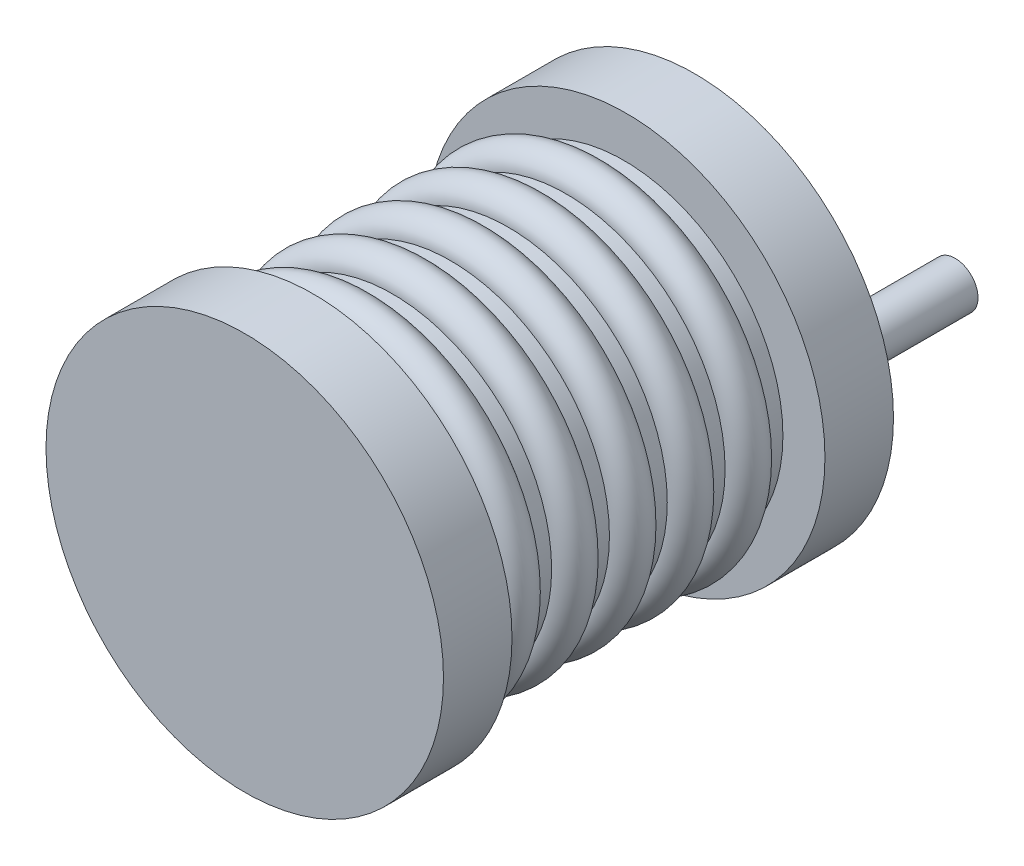
ISO-10303-21;
HEADER;
FILE_DESCRIPTION(('STEP AP214'),'2;1');
FILE_NAME('part.step','',(''),(''),'','','');
FILE_SCHEMA(('AUTOMOTIVE_DESIGN { 1 0 10303 214 1 1 1 1 }'));
ENDSEC;
DATA;
#1=APPLICATION_CONTEXT('core data for automotive mechanical design processes');
#2=APPLICATION_PROTOCOL_DEFINITION('international standard','automotive_design',2000,#1);
#3=PRODUCT_CONTEXT('',#1,'mechanical');
#4=PRODUCT('Part','Part','',(#3));
#5=PRODUCT_RELATED_PRODUCT_CATEGORY('part','',(#4));
#6=PRODUCT_DEFINITION_FORMATION('','',#4);
#7=PRODUCT_DEFINITION_CONTEXT('part definition',#1,'design');
#8=PRODUCT_DEFINITION('design','',#6,#7);
#9=PRODUCT_DEFINITION_SHAPE('','',#8);
#10=(LENGTH_UNIT() NAMED_UNIT(*) SI_UNIT(.MILLI.,.METRE.));
#11=(NAMED_UNIT(*) PLANE_ANGLE_UNIT() SI_UNIT($,.RADIAN.));
#12=(NAMED_UNIT(*) SI_UNIT($,.STERADIAN.) SOLID_ANGLE_UNIT());
#13=UNCERTAINTY_MEASURE_WITH_UNIT(LENGTH_MEASURE(1.E-05),#10,'distance_accuracy_value','');
#14=(GEOMETRIC_REPRESENTATION_CONTEXT(3) GLOBAL_UNCERTAINTY_ASSIGNED_CONTEXT((#13)) GLOBAL_UNIT_ASSIGNED_CONTEXT((#10,
#11,#12)) REPRESENTATION_CONTEXT('',''));
#15=CARTESIAN_POINT('',(0.,0.,0.));
#16=DIRECTION('',(0.,0.,1.));
#17=DIRECTION('',(1.,0.,0.));
#18=AXIS2_PLACEMENT_3D('',#15,#16,#17);
#19=CARTESIAN_POINT('',(2.5,0.,1.75));
#20=DIRECTION('',(0.,0.,1.));
#21=DIRECTION('',(1.,0.,0.));
#22=AXIS2_PLACEMENT_3D('',#19,#20,#21);
#23=CYLINDRICAL_SURFACE('',#22,3.48);
#24=CARTESIAN_POINT('',(2.5,0.,2.171875));
#25=DIRECTION('',(0.,0.,-1.));
#26=DIRECTION('',(1.,0.,0.));
#27=AXIS2_PLACEMENT_3D('',#24,#25,#26);
#28=CIRCLE('',#27,3.48);
#29=CARTESIAN_POINT('',(5.98,0.,2.171875));
#30=VERTEX_POINT('',#29);
#31=EDGE_CURVE('E10',#30,#30,#28,.T.);
#32=ORIENTED_EDGE('',*,*,#31,.T.);
#33=EDGE_LOOP('',(#32));
#34=FACE_BOUND('',#33,.T.);
#35=CARTESIAN_POINT('',(2.5,0.,1.75));
#36=DIRECTION('',(0.,0.,-1.));
#37=DIRECTION('',(1.,0.,0.));
#38=AXIS2_PLACEMENT_3D('',#35,#36,#37);
#39=CIRCLE('',#38,3.48);
#40=CARTESIAN_POINT('',(5.98,0.,1.75));
#41=VERTEX_POINT('',#40);
#42=EDGE_CURVE('E23',#41,#41,#39,.T.);
#43=ORIENTED_EDGE('',*,*,#42,.F.);
#44=EDGE_LOOP('',(#43));
#45=FACE_BOUND('',#44,.T.);
#46=ADVANCED_FACE('F15',(#34,#45),#23,.T.);
#47=CARTESIAN_POINT('',(2.5,0.,1.75));
#48=DIRECTION('',(0.,0.,-1.));
#49=DIRECTION('',(1.,0.,0.));
#50=AXIS2_PLACEMENT_3D('',#47,#48,#49);
#51=PLANE('',#50);
#52=ORIENTED_EDGE('',*,*,#42,.T.);
#53=EDGE_LOOP('',(#52));
#54=FACE_BOUND('',#53,.T.);
#55=CARTESIAN_POINT('',(2.5,0.,1.75));
#56=DIRECTION('',(0.,0.,-1.));
#57=DIRECTION('',(1.,0.,0.));
#58=AXIS2_PLACEMENT_3D('',#55,#56,#57);
#59=CIRCLE('',#58,0.87);
#60=CARTESIAN_POINT('',(3.37,0.,1.75));
#61=VERTEX_POINT('',#60);
#62=EDGE_CURVE('E31',#61,#61,#59,.T.);
#63=ORIENTED_EDGE('',*,*,#62,.F.);
#64=EDGE_LOOP('',(#63));
#65=FACE_BOUND('',#64,.T.);
#66=ADVANCED_FACE('F112',(#54,#65),#51,.T.);
#67=CARTESIAN_POINT('',(2.5,0.,2.59375));
#68=DIRECTION('',(0.,0.,1.));
#69=DIRECTION('',(1.,0.,0.));
#70=AXIS2_PLACEMENT_3D('',#67,#68,#69);
#71=TOROIDAL_SURFACE('',#70,3.48,0.421875);
#72=CARTESIAN_POINT('',(2.5,0.,3.015625));
#73=DIRECTION('',(0.,0.,-1.));
#74=DIRECTION('',(1.,0.,0.));
#75=AXIS2_PLACEMENT_3D('',#72,#73,#74);
#76=CIRCLE('',#75,3.48);
#77=CARTESIAN_POINT('',(5.98,0.,3.015625));
#78=VERTEX_POINT('',#77);
#79=EDGE_CURVE('E28',#78,#78,#76,.T.);
#80=ORIENTED_EDGE('',*,*,#79,.T.);
#81=EDGE_LOOP('',(#80));
#82=FACE_BOUND('',#81,.T.);
#83=ORIENTED_EDGE('',*,*,#31,.F.);
#84=EDGE_LOOP('',(#83));
#85=FACE_BOUND('',#84,.T.);
#86=ADVANCED_FACE('F117',(#82,#85),#71,.T.);
#87=CARTESIAN_POINT('',(2.5,0.,1.7));
#88=DIRECTION('',(0.,0.,1.));
#89=DIRECTION('',(1.,0.,0.));
#90=AXIS2_PLACEMENT_3D('',#87,#88,#89);
#91=CYLINDRICAL_SURFACE('',#90,0.87);
#92=ORIENTED_EDGE('',*,*,#62,.T.);
#93=EDGE_LOOP('',(#92));
#94=FACE_BOUND('',#93,.T.);
#95=CARTESIAN_POINT('',(2.5,0.,1.7));
#96=DIRECTION('',(0.,0.,-1.));
#97=DIRECTION('',(1.,0.,0.));
#98=AXIS2_PLACEMENT_3D('',#95,#96,#97);
#99=CIRCLE('',#98,0.87);
#100=CARTESIAN_POINT('',(3.37,0.,1.7));
#101=VERTEX_POINT('',#100);
#102=EDGE_CURVE('E37',#101,#101,#99,.T.);
#103=ORIENTED_EDGE('',*,*,#102,.F.);
#104=EDGE_LOOP('',(#103));
#105=FACE_BOUND('',#104,.T.);
#106=ADVANCED_FACE('F124',(#94,#105),#91,.T.);
#107=CARTESIAN_POINT('',(2.5,0.,3.4375));
#108=DIRECTION('',(0.,0.,-1.));
#109=DIRECTION('',(1.,0.,0.));
#110=AXIS2_PLACEMENT_3D('',#107,#108,#109);
#111=CYLINDRICAL_SURFACE('',#110,3.48);
#112=ORIENTED_EDGE('',*,*,#79,.F.);
#113=EDGE_LOOP('',(#112));
#114=FACE_BOUND('',#113,.T.);
#115=CARTESIAN_POINT('',(2.5,0.,3.4375));
#116=DIRECTION('',(0.,0.,-1.));
#117=DIRECTION('',(1.,0.,0.));
#118=AXIS2_PLACEMENT_3D('',#115,#116,#117);
#119=CIRCLE('',#118,3.48);
#120=CARTESIAN_POINT('',(5.98,0.,3.4375));
#121=VERTEX_POINT('',#120);
#122=EDGE_CURVE('E34',#121,#121,#119,.T.);
#123=ORIENTED_EDGE('',*,*,#122,.T.);
#124=EDGE_LOOP('',(#123));
#125=FACE_BOUND('',#124,.T.);
#126=ADVANCED_FACE('F128',(#114,#125),#111,.T.);
#127=CARTESIAN_POINT('',(2.5,0.,1.7));
#128=DIRECTION('',(0.,0.,-1.));
#129=DIRECTION('',(1.,0.,0.));
#130=AXIS2_PLACEMENT_3D('',#127,#128,#129);
#131=PLANE('',#130);
#132=CARTESIAN_POINT('',(2.5,0.,1.7));
#133=DIRECTION('',(0.,0.,-1.));
#134=DIRECTION('',(1.,0.,0.));
#135=AXIS2_PLACEMENT_3D('',#132,#133,#134);
#136=CIRCLE('',#135,4.35);
#137=CARTESIAN_POINT('',(6.85,0.,1.7));
#138=VERTEX_POINT('',#137);
#139=EDGE_CURVE('E43',#138,#138,#136,.T.);
#140=ORIENTED_EDGE('',*,*,#139,.F.);
#141=EDGE_LOOP('',(#140));
#142=FACE_BOUND('',#141,.T.);
#143=ORIENTED_EDGE('',*,*,#102,.T.);
#144=EDGE_LOOP('',(#143));
#145=FACE_BOUND('',#144,.T.);
#146=ADVANCED_FACE('F132',(#142,#145),#131,.F.);
#147=CARTESIAN_POINT('',(2.5,0.,3.859375));
#148=DIRECTION('',(0.,0.,1.));
#149=DIRECTION('',(1.,0.,0.));
#150=AXIS2_PLACEMENT_3D('',#147,#148,#149);
#151=TOROIDAL_SURFACE('',#150,3.48,0.421875);
#152=CARTESIAN_POINT('',(2.5,0.,4.28125));
#153=DIRECTION('',(0.,0.,-1.));
#154=DIRECTION('',(1.,0.,0.));
#155=AXIS2_PLACEMENT_3D('',#152,#153,#154);
#156=CIRCLE('',#155,3.48);
#157=CARTESIAN_POINT('',(5.98,0.,4.28125));
#158=VERTEX_POINT('',#157);
#159=EDGE_CURVE('E40',#158,#158,#156,.T.);
#160=ORIENTED_EDGE('',*,*,#159,.T.);
#161=EDGE_LOOP('',(#160));
#162=FACE_BOUND('',#161,.T.);
#163=ORIENTED_EDGE('',*,*,#122,.F.);
#164=EDGE_LOOP('',(#163));
#165=FACE_BOUND('',#164,.T.);
#166=ADVANCED_FACE('F136',(#162,#165),#151,.T.);
#167=CARTESIAN_POINT('',(2.5,0.,0.2));
#168=DIRECTION('',(0.,0.,1.));
#169=DIRECTION('',(1.,0.,0.));
#170=AXIS2_PLACEMENT_3D('',#167,#168,#169);
#171=CYLINDRICAL_SURFACE('',#170,4.35);
#172=ORIENTED_EDGE('',*,*,#139,.T.);
#173=EDGE_LOOP('',(#172));
#174=FACE_BOUND('',#173,.T.);
#175=CARTESIAN_POINT('',(2.5,0.,0.2));
#176=DIRECTION('',(0.,0.,-1.));
#177=DIRECTION('',(1.,0.,0.));
#178=AXIS2_PLACEMENT_3D('',#175,#176,#177);
#179=CIRCLE('',#178,4.35);
#180=CARTESIAN_POINT('',(6.85,0.,0.2));
#181=VERTEX_POINT('',#180);
#182=EDGE_CURVE('E49',#181,#181,#179,.T.);
#183=ORIENTED_EDGE('',*,*,#182,.F.);
#184=EDGE_LOOP('',(#183));
#185=FACE_BOUND('',#184,.T.);
#186=ADVANCED_FACE('F140',(#174,#185),#171,.T.);
#187=CARTESIAN_POINT('',(2.5,0.,4.703125));
#188=DIRECTION('',(0.,0.,-1.));
#189=DIRECTION('',(1.,0.,0.));
#190=AXIS2_PLACEMENT_3D('',#187,#188,#189);
#191=CYLINDRICAL_SURFACE('',#190,3.48);
#192=ORIENTED_EDGE('',*,*,#159,.F.);
#193=EDGE_LOOP('',(#192));
#194=FACE_BOUND('',#193,.T.);
#195=CARTESIAN_POINT('',(2.5,0.,4.703125));
#196=DIRECTION('',(0.,0.,-1.));
#197=DIRECTION('',(1.,0.,0.));
#198=AXIS2_PLACEMENT_3D('',#195,#196,#197);
#199=CIRCLE('',#198,3.48);
#200=CARTESIAN_POINT('',(5.98,0.,4.703125));
#201=VERTEX_POINT('',#200);
#202=EDGE_CURVE('E46',#201,#201,#199,.T.);
#203=ORIENTED_EDGE('',*,*,#202,.T.);
#204=EDGE_LOOP('',(#203));
#205=FACE_BOUND('',#204,.T.);
#206=ADVANCED_FACE('F144',(#194,#205),#191,.T.);
#207=CARTESIAN_POINT('',(2.5,0.,0.2));
#208=DIRECTION('',(0.,0.,-1.));
#209=DIRECTION('',(1.,0.,0.));
#210=AXIS2_PLACEMENT_3D('',#207,#208,#209);
#211=PLANE('',#210);
#212=ORIENTED_EDGE('',*,*,#182,.T.);
#213=EDGE_LOOP('',(#212));
#214=FACE_BOUND('',#213,.T.);
#215=CARTESIAN_POINT('',(0.,0.,0.2));
#216=DIRECTION('',(0.,0.,1.));
#217=DIRECTION('',(1.,0.,0.));
#218=AXIS2_PLACEMENT_3D('',#215,#216,#217);
#219=CIRCLE('',#218,0.5);
#220=CARTESIAN_POINT('',(0.5,0.,0.2));
#221=VERTEX_POINT('',#220);
#222=EDGE_CURVE('E52',#221,#221,#219,.T.);
#223=ORIENTED_EDGE('',*,*,#222,.T.);
#224=EDGE_LOOP('',(#223));
#225=FACE_BOUND('',#224,.T.);
#226=CARTESIAN_POINT('',(2.5,0.,0.2));
#227=DIRECTION('',(0.,0.,-1.));
#228=DIRECTION('',(1.,0.,0.));
#229=AXIS2_PLACEMENT_3D('',#226,#227,#228);
#230=CIRCLE('',#229,1.5);
#231=CARTESIAN_POINT('',(4.,0.,0.2));
#232=VERTEX_POINT('',#231);
#233=EDGE_CURVE('E58',#232,#232,#230,.T.);
#234=ORIENTED_EDGE('',*,*,#233,.F.);
#235=EDGE_LOOP('',(#234));
#236=FACE_BOUND('',#235,.T.);
#237=CARTESIAN_POINT('',(5.,0.,0.2));
#238=DIRECTION('',(0.,0.,1.));
#239=DIRECTION('',(1.,0.,0.));
#240=AXIS2_PLACEMENT_3D('',#237,#238,#239);
#241=CIRCLE('',#240,0.5);
#242=CARTESIAN_POINT('',(5.5,0.,0.2));
#243=VERTEX_POINT('',#242);
#244=EDGE_CURVE('E57',#243,#243,#241,.T.);
#245=ORIENTED_EDGE('',*,*,#244,.T.);
#246=EDGE_LOOP('',(#245));
#247=FACE_BOUND('',#246,.T.);
#248=ADVANCED_FACE('F148',(#214,#225,#236,#247),#211,.T.);
#249=CARTESIAN_POINT('',(2.5,0.,5.125));
#250=DIRECTION('',(0.,0.,1.));
#251=DIRECTION('',(1.,0.,0.));
#252=AXIS2_PLACEMENT_3D('',#249,#250,#251);
#253=TOROIDAL_SURFACE('',#252,3.48,0.421875);
#254=CARTESIAN_POINT('',(2.5,0.,5.546875));
#255=DIRECTION('',(0.,0.,-1.));
#256=DIRECTION('',(1.,0.,0.));
#257=AXIS2_PLACEMENT_3D('',#254,#255,#256);
#258=CIRCLE('',#257,3.48);
#259=CARTESIAN_POINT('',(5.98,0.,5.546875));
#260=VERTEX_POINT('',#259);
#261=EDGE_CURVE('E65',#260,#260,#258,.T.);
#262=ORIENTED_EDGE('',*,*,#261,.T.);
#263=EDGE_LOOP('',(#262));
#264=FACE_BOUND('',#263,.T.);
#265=ORIENTED_EDGE('',*,*,#202,.F.);
#266=EDGE_LOOP('',(#265));
#267=FACE_BOUND('',#266,.T.);
#268=ADVANCED_FACE('F152',(#264,#267),#253,.T.);
#269=CARTESIAN_POINT('',(0.,0.,0.5));
#270=DIRECTION('',(0.,0.,1.));
#271=DIRECTION('',(1.,0.,0.));
#272=AXIS2_PLACEMENT_3D('',#269,#270,#271);
#273=CYLINDRICAL_SURFACE('',#272,0.5);
#274=CARTESIAN_POINT('',(0.,0.,-3.));
#275=DIRECTION('',(0.,0.,1.));
#276=DIRECTION('',(1.,0.,0.));
#277=AXIS2_PLACEMENT_3D('',#274,#275,#276);
#278=CIRCLE('',#277,0.5);
#279=CARTESIAN_POINT('',(0.5,0.,-3.));
#280=VERTEX_POINT('',#279);
#281=EDGE_CURVE('E61',#280,#280,#278,.T.);
#282=ORIENTED_EDGE('',*,*,#281,.T.);
#283=EDGE_LOOP('',(#282));
#284=FACE_BOUND('',#283,.T.);
#285=ORIENTED_EDGE('',*,*,#222,.F.);
#286=EDGE_LOOP('',(#285));
#287=FACE_BOUND('',#286,.T.);
#288=ADVANCED_FACE('F156',(#284,#287),#273,.T.);
#289=CARTESIAN_POINT('',(2.5,0.,0.05));
#290=DIRECTION('',(0.,0.,1.));
#291=DIRECTION('',(1.,0.,0.));
#292=AXIS2_PLACEMENT_3D('',#289,#290,#291);
#293=CYLINDRICAL_SURFACE('',#292,1.5);
#294=ORIENTED_EDGE('',*,*,#233,.T.);
#295=EDGE_LOOP('',(#294));
#296=FACE_BOUND('',#295,.T.);
#297=CARTESIAN_POINT('',(2.5,0.,0.05));
#298=DIRECTION('',(0.,0.,-1.));
#299=DIRECTION('',(1.,0.,0.));
#300=AXIS2_PLACEMENT_3D('',#297,#298,#299);
#301=CIRCLE('',#300,1.5);
#302=CARTESIAN_POINT('',(4.,0.,0.05));
#303=VERTEX_POINT('',#302);
#304=EDGE_CURVE('E70',#303,#303,#301,.T.);
#305=ORIENTED_EDGE('',*,*,#304,.F.);
#306=EDGE_LOOP('',(#305));
#307=FACE_BOUND('',#306,.T.);
#308=ADVANCED_FACE('F160',(#296,#307),#293,.T.);
#309=CARTESIAN_POINT('',(5.,0.,0.5));
#310=DIRECTION('',(0.,0.,1.));
#311=DIRECTION('',(1.,0.,0.));
#312=AXIS2_PLACEMENT_3D('',#309,#310,#311);
#313=CYLINDRICAL_SURFACE('',#312,0.5);
#314=CARTESIAN_POINT('',(5.,0.,-3.));
#315=DIRECTION('',(0.,0.,1.));
#316=DIRECTION('',(1.,0.,0.));
#317=AXIS2_PLACEMENT_3D('',#314,#315,#316);
#318=CIRCLE('',#317,0.5);
#319=CARTESIAN_POINT('',(5.5,0.,-3.));
#320=VERTEX_POINT('',#319);
#321=EDGE_CURVE('E62',#320,#320,#318,.T.);
#322=ORIENTED_EDGE('',*,*,#321,.T.);
#323=EDGE_LOOP('',(#322));
#324=FACE_BOUND('',#323,.T.);
#325=ORIENTED_EDGE('',*,*,#244,.F.);
#326=EDGE_LOOP('',(#325));
#327=FACE_BOUND('',#326,.T.);
#328=ADVANCED_FACE('F164',(#324,#327),#313,.T.);
#329=CARTESIAN_POINT('',(2.5,0.,5.96875));
#330=DIRECTION('',(0.,0.,-1.));
#331=DIRECTION('',(1.,0.,0.));
#332=AXIS2_PLACEMENT_3D('',#329,#330,#331);
#333=CYLINDRICAL_SURFACE('',#332,3.48);
#334=ORIENTED_EDGE('',*,*,#261,.F.);
#335=EDGE_LOOP('',(#334));
#336=FACE_BOUND('',#335,.T.);
#337=CARTESIAN_POINT('',(2.5,0.,5.96875));
#338=DIRECTION('',(0.,0.,-1.));
#339=DIRECTION('',(1.,0.,0.));
#340=AXIS2_PLACEMENT_3D('',#337,#338,#339);
#341=CIRCLE('',#340,3.48);
#342=CARTESIAN_POINT('',(5.98,0.,5.96875));
#343=VERTEX_POINT('',#342);
#344=EDGE_CURVE('E73',#343,#343,#341,.T.);
#345=ORIENTED_EDGE('',*,*,#344,.T.);
#346=EDGE_LOOP('',(#345));
#347=FACE_BOUND('',#346,.T.);
#348=ADVANCED_FACE('F168',(#336,#347),#333,.T.);
#349=CARTESIAN_POINT('',(0.5,0.,-3.));
#350=DIRECTION('',(0.,0.,-1.));
#351=DIRECTION('',(-1.,0.,0.));
#352=AXIS2_PLACEMENT_3D('',#349,#350,#351);
#353=PLANE('',#352);
#354=ORIENTED_EDGE('',*,*,#281,.F.);
#355=EDGE_LOOP('',(#354));
#356=FACE_BOUND('',#355,.T.);
#357=ADVANCED_FACE('F172',(#356),#353,.T.);
#358=CARTESIAN_POINT('',(2.5,0.,0.05));
#359=DIRECTION('',(0.,0.,-1.));
#360=DIRECTION('',(1.,0.,0.));
#361=AXIS2_PLACEMENT_3D('',#358,#359,#360);
#362=PLANE('',#361);
#363=ORIENTED_EDGE('',*,*,#304,.T.);
#364=EDGE_LOOP('',(#363));
#365=FACE_BOUND('',#364,.T.);
#366=ADVANCED_FACE('F176',(#365),#362,.T.);
#367=CARTESIAN_POINT('',(5.5,0.,-3.));
#368=DIRECTION('',(0.,0.,-1.));
#369=DIRECTION('',(-1.,0.,0.));
#370=AXIS2_PLACEMENT_3D('',#367,#368,#369);
#371=PLANE('',#370);
#372=ORIENTED_EDGE('',*,*,#321,.F.);
#373=EDGE_LOOP('',(#372));
#374=FACE_BOUND('',#373,.T.);
#375=ADVANCED_FACE('F180',(#374),#371,.T.);
#376=CARTESIAN_POINT('',(2.5,0.,6.390625));
#377=DIRECTION('',(0.,0.,1.));
#378=DIRECTION('',(1.,0.,0.));
#379=AXIS2_PLACEMENT_3D('',#376,#377,#378);
#380=TOROIDAL_SURFACE('',#379,3.48,0.421875);
#381=CARTESIAN_POINT('',(2.5,0.,6.8125));
#382=DIRECTION('',(0.,0.,-1.));
#383=DIRECTION('',(1.,0.,0.));
#384=AXIS2_PLACEMENT_3D('',#381,#382,#383);
#385=CIRCLE('',#384,3.48);
#386=CARTESIAN_POINT('',(5.98,0.,6.8125));
#387=VERTEX_POINT('',#386);
#388=EDGE_CURVE('E74',#387,#387,#385,.T.);
#389=ORIENTED_EDGE('',*,*,#388,.T.);
#390=EDGE_LOOP('',(#389));
#391=FACE_BOUND('',#390,.T.);
#392=ORIENTED_EDGE('',*,*,#344,.F.);
#393=EDGE_LOOP('',(#392));
#394=FACE_BOUND('',#393,.T.);
#395=ADVANCED_FACE('F184',(#391,#394),#380,.T.);
#396=CARTESIAN_POINT('',(2.5,0.,7.234375));
#397=DIRECTION('',(0.,0.,-1.));
#398=DIRECTION('',(1.,0.,0.));
#399=AXIS2_PLACEMENT_3D('',#396,#397,#398);
#400=CYLINDRICAL_SURFACE('',#399,3.48);
#401=ORIENTED_EDGE('',*,*,#388,.F.);
#402=EDGE_LOOP('',(#401));
#403=FACE_BOUND('',#402,.T.);
#404=CARTESIAN_POINT('',(2.5,0.,7.234375));
#405=DIRECTION('',(0.,0.,-1.));
#406=DIRECTION('',(1.,0.,0.));
#407=AXIS2_PLACEMENT_3D('',#404,#405,#406);
#408=CIRCLE('',#407,3.48);
#409=CARTESIAN_POINT('',(5.98,0.,7.234375));
#410=VERTEX_POINT('',#409);
#411=EDGE_CURVE('E81',#410,#410,#408,.T.);
#412=ORIENTED_EDGE('',*,*,#411,.T.);
#413=EDGE_LOOP('',(#412));
#414=FACE_BOUND('',#413,.T.);
#415=ADVANCED_FACE('F188',(#403,#414),#400,.T.);
#416=CARTESIAN_POINT('',(2.5,0.,7.65625));
#417=DIRECTION('',(0.,0.,1.));
#418=DIRECTION('',(1.,0.,0.));
#419=AXIS2_PLACEMENT_3D('',#416,#417,#418);
#420=TOROIDAL_SURFACE('',#419,3.48,0.421875);
#421=CARTESIAN_POINT('',(2.5,0.,8.078125));
#422=DIRECTION('',(0.,0.,-1.));
#423=DIRECTION('',(1.,0.,0.));
#424=AXIS2_PLACEMENT_3D('',#421,#422,#423);
#425=CIRCLE('',#424,3.48);
#426=CARTESIAN_POINT('',(5.98,0.,8.078125));
#427=VERTEX_POINT('',#426);
#428=EDGE_CURVE('E84',#427,#427,#425,.T.);
#429=ORIENTED_EDGE('',*,*,#428,.T.);
#430=EDGE_LOOP('',(#429));
#431=FACE_BOUND('',#430,.T.);
#432=ORIENTED_EDGE('',*,*,#411,.F.);
#433=EDGE_LOOP('',(#432));
#434=FACE_BOUND('',#433,.T.);
#435=ADVANCED_FACE('F192',(#431,#434),#420,.T.);
#436=CARTESIAN_POINT('',(2.5,0.,8.5));
#437=DIRECTION('',(0.,0.,-1.));
#438=DIRECTION('',(1.,0.,0.));
#439=AXIS2_PLACEMENT_3D('',#436,#437,#438);
#440=CYLINDRICAL_SURFACE('',#439,3.48);
#441=ORIENTED_EDGE('',*,*,#428,.F.);
#442=EDGE_LOOP('',(#441));
#443=FACE_BOUND('',#442,.T.);
#444=CARTESIAN_POINT('',(2.5,0.,8.5));
#445=DIRECTION('',(0.,0.,-1.));
#446=DIRECTION('',(1.,0.,0.));
#447=AXIS2_PLACEMENT_3D('',#444,#445,#446);
#448=CIRCLE('',#447,3.48);
#449=CARTESIAN_POINT('',(5.98,0.,8.5));
#450=VERTEX_POINT('',#449);
#451=EDGE_CURVE('E87',#450,#450,#448,.T.);
#452=ORIENTED_EDGE('',*,*,#451,.T.);
#453=EDGE_LOOP('',(#452));
#454=FACE_BOUND('',#453,.T.);
#455=ADVANCED_FACE('F196',(#443,#454),#440,.T.);
#456=CARTESIAN_POINT('',(2.5,0.,8.5));
#457=DIRECTION('',(0.,0.,-1.));
#458=DIRECTION('',(1.,0.,0.));
#459=AXIS2_PLACEMENT_3D('',#456,#457,#458);
#460=PLANE('',#459);
#461=ORIENTED_EDGE('',*,*,#451,.F.);
#462=EDGE_LOOP('',(#461));
#463=FACE_BOUND('',#462,.T.);
#464=CARTESIAN_POINT('',(2.5,0.,8.5));
#465=DIRECTION('',(0.,0.,-1.));
#466=DIRECTION('',(1.,0.,0.));
#467=AXIS2_PLACEMENT_3D('',#464,#465,#466);
#468=CIRCLE('',#467,0.87);
#469=CARTESIAN_POINT('',(3.37,0.,8.5));
#470=VERTEX_POINT('',#469);
#471=EDGE_CURVE('E90',#470,#470,#468,.T.);
#472=ORIENTED_EDGE('',*,*,#471,.T.);
#473=EDGE_LOOP('',(#472));
#474=FACE_BOUND('',#473,.T.);
#475=ADVANCED_FACE('F200',(#463,#474),#460,.F.);
#476=CARTESIAN_POINT('',(2.5,0.,1.7));
#477=DIRECTION('',(0.,0.,1.));
#478=DIRECTION('',(1.,0.,0.));
#479=AXIS2_PLACEMENT_3D('',#476,#477,#478);
#480=CYLINDRICAL_SURFACE('',#479,0.87);
#481=CARTESIAN_POINT('',(2.5,0.,8.55));
#482=DIRECTION('',(0.,0.,-1.));
#483=DIRECTION('',(1.,0.,0.));
#484=AXIS2_PLACEMENT_3D('',#481,#482,#483);
#485=CIRCLE('',#484,0.87);
#486=CARTESIAN_POINT('',(3.37,0.,8.55));
#487=VERTEX_POINT('',#486);
#488=EDGE_CURVE('E93',#487,#487,#485,.T.);
#489=ORIENTED_EDGE('',*,*,#488,.T.);
#490=EDGE_LOOP('',(#489));
#491=FACE_BOUND('',#490,.T.);
#492=ORIENTED_EDGE('',*,*,#471,.F.);
#493=EDGE_LOOP('',(#492));
#494=FACE_BOUND('',#493,.T.);
#495=ADVANCED_FACE('F204',(#491,#494),#480,.T.);
#496=CARTESIAN_POINT('',(2.5,0.,8.55));
#497=DIRECTION('',(0.,0.,-1.));
#498=DIRECTION('',(1.,0.,0.));
#499=AXIS2_PLACEMENT_3D('',#496,#497,#498);
#500=PLANE('',#499);
#501=ORIENTED_EDGE('',*,*,#488,.F.);
#502=EDGE_LOOP('',(#501));
#503=FACE_BOUND('',#502,.T.);
#504=CARTESIAN_POINT('',(2.5,0.,8.55));
#505=DIRECTION('',(0.,0.,-1.));
#506=DIRECTION('',(1.,0.,0.));
#507=AXIS2_PLACEMENT_3D('',#504,#505,#506);
#508=CIRCLE('',#507,4.35);
#509=CARTESIAN_POINT('',(6.85,0.,8.55));
#510=VERTEX_POINT('',#509);
#511=EDGE_CURVE('E95',#510,#510,#508,.T.);
#512=ORIENTED_EDGE('',*,*,#511,.T.);
#513=EDGE_LOOP('',(#512));
#514=FACE_BOUND('',#513,.T.);
#515=ADVANCED_FACE('F110',(#503,#514),#500,.T.);
#516=CARTESIAN_POINT('',(2.5,0.,8.55));
#517=DIRECTION('',(0.,0.,1.));
#518=DIRECTION('',(1.,0.,0.));
#519=AXIS2_PLACEMENT_3D('',#516,#517,#518);
#520=CYLINDRICAL_SURFACE('',#519,4.35);
#521=CARTESIAN_POINT('',(2.5,0.,10.05));
#522=DIRECTION('',(0.,0.,-1.));
#523=DIRECTION('',(1.,0.,0.));
#524=AXIS2_PLACEMENT_3D('',#521,#522,#523);
#525=CIRCLE('',#524,4.35);
#526=CARTESIAN_POINT('',(6.85,0.,10.05));
#527=VERTEX_POINT('',#526);
#528=EDGE_CURVE('E19',#527,#527,#525,.T.);
#529=ORIENTED_EDGE('',*,*,#528,.T.);
#530=EDGE_LOOP('',(#529));
#531=FACE_BOUND('',#530,.T.);
#532=ORIENTED_EDGE('',*,*,#511,.F.);
#533=EDGE_LOOP('',(#532));
#534=FACE_BOUND('',#533,.T.);
#535=ADVANCED_FACE('F102',(#531,#534),#520,.T.);
#536=CARTESIAN_POINT('',(2.5,0.,10.05));
#537=DIRECTION('',(0.,0.,-1.));
#538=DIRECTION('',(1.,0.,0.));
#539=AXIS2_PLACEMENT_3D('',#536,#537,#538);
#540=PLANE('',#539);
#541=ORIENTED_EDGE('',*,*,#528,.F.);
#542=EDGE_LOOP('',(#541));
#543=FACE_BOUND('',#542,.T.);
#544=ADVANCED_FACE('F17',(#543),#540,.F.);
#545=CLOSED_SHELL('',(#46,#66,#86,#106,#126,#146,#166,#186,#206,#248,#268,#288,#308,#328,#348,
#357,#366,#375,#395,#415,#435,#455,#475,#495,#515,#535,#544));
#546=MANIFOLD_SOLID_BREP('B1',#545);
#547=ADVANCED_BREP_SHAPE_REPRESENTATION('',(#18,#546),#14);
#548=SHAPE_DEFINITION_REPRESENTATION(#9,#547);
ENDSEC;
END-ISO-10303-21;
